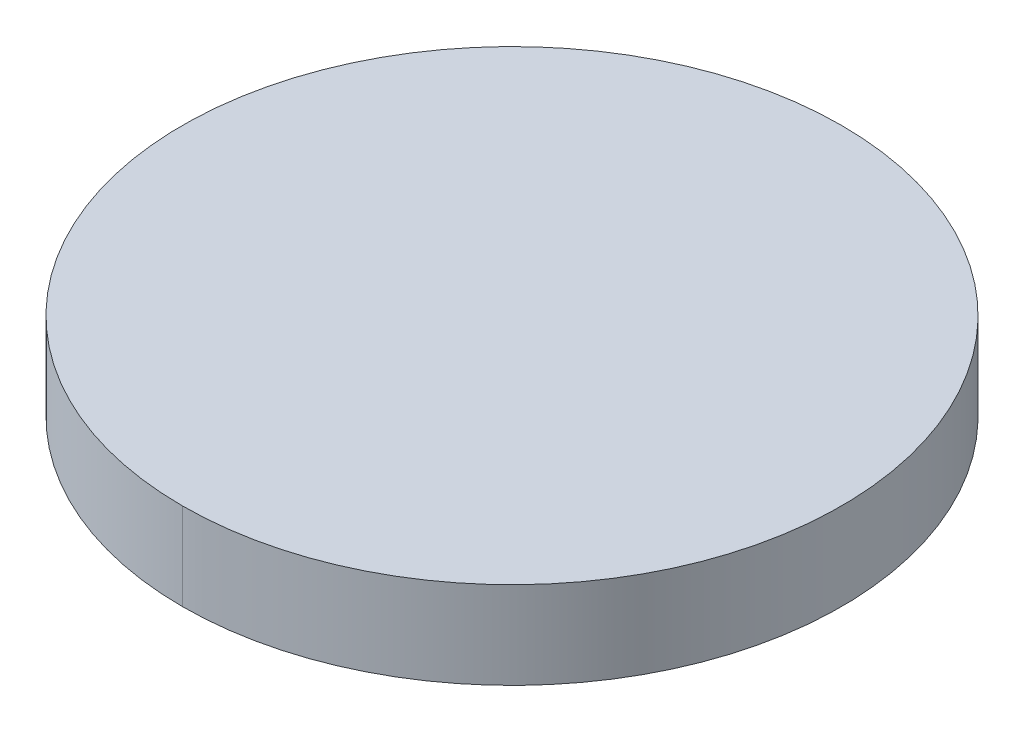
ISO-10303-21;
HEADER;
FILE_DESCRIPTION(('STEP AP214'),'2;1');
FILE_NAME('part.step','',(''),(''),'','','');
FILE_SCHEMA(('AUTOMOTIVE_DESIGN { 1 0 10303 214 1 1 1 1 }'));
ENDSEC;
DATA;
#1=APPLICATION_CONTEXT('core data for automotive mechanical design processes');
#2=APPLICATION_PROTOCOL_DEFINITION('international standard','automotive_design',2000,#1);
#3=PRODUCT_CONTEXT('',#1,'mechanical');
#4=PRODUCT('Part','Part','',(#3));
#5=PRODUCT_RELATED_PRODUCT_CATEGORY('part','',(#4));
#6=PRODUCT_DEFINITION_FORMATION('','',#4);
#7=PRODUCT_DEFINITION_CONTEXT('part definition',#1,'design');
#8=PRODUCT_DEFINITION('design','',#6,#7);
#9=PRODUCT_DEFINITION_SHAPE('','',#8);
#10=(LENGTH_UNIT() NAMED_UNIT(*) SI_UNIT(.MILLI.,.METRE.));
#11=(NAMED_UNIT(*) PLANE_ANGLE_UNIT() SI_UNIT($,.RADIAN.));
#12=(NAMED_UNIT(*) SI_UNIT($,.STERADIAN.) SOLID_ANGLE_UNIT());
#13=UNCERTAINTY_MEASURE_WITH_UNIT(LENGTH_MEASURE(1.E-05),#10,'distance_accuracy_value','');
#14=(GEOMETRIC_REPRESENTATION_CONTEXT(3) GLOBAL_UNCERTAINTY_ASSIGNED_CONTEXT((#13)) GLOBAL_UNIT_ASSIGNED_CONTEXT((#10,
#11,#12)) REPRESENTATION_CONTEXT('',''));
#15=CARTESIAN_POINT('',(0.,0.,0.));
#16=DIRECTION('',(0.,0.,1.));
#17=DIRECTION('',(1.,0.,0.));
#18=AXIS2_PLACEMENT_3D('',#15,#16,#17);
#19=CARTESIAN_POINT('',(0.908753238835547,0.,0.));
#20=DIRECTION('',(0.,1.,0.));
#21=DIRECTION('',(1.,0.,0.));
#22=AXIS2_PLACEMENT_3D('',#19,#20,#21);
#23=PLANE('',#22);
#24=CARTESIAN_POINT('',(0.908753238835547,0.,0.));
#25=DIRECTION('',(0.,1.,0.));
#26=DIRECTION('',(0.,0.,1.));
#27=AXIS2_PLACEMENT_3D('',#24,#25,#26);
#28=CIRCLE('',#27,37.777278100094);
#29=CARTESIAN_POINT('',(0.908753238835547,0.,-37.777278100094));
#30=VERTEX_POINT('',#29);
#31=CARTESIAN_POINT('',(0.908753238835551,0.,37.777278100094));
#32=VERTEX_POINT('',#31);
#33=EDGE_CURVE('E11',#30,#32,#28,.T.);
#34=ORIENTED_EDGE('',*,*,#33,.F.);
#35=CARTESIAN_POINT('',(0.908753238835547,0.,0.));
#36=DIRECTION('',(0.,1.,0.));
#37=DIRECTION('',(0.,0.,1.));
#38=AXIS2_PLACEMENT_3D('',#35,#36,#37);
#39=CIRCLE('',#38,37.777278100094);
#40=EDGE_CURVE('E66',#32,#30,#39,.T.);
#41=ORIENTED_EDGE('',*,*,#40,.F.);
#42=EDGE_LOOP('',(#34,#41));
#43=FACE_BOUND('',#42,.T.);
#44=ADVANCED_FACE('F17',(#43),#23,.F.);
#45=CARTESIAN_POINT('',(0.908753238835547,10.,0.));
#46=DIRECTION('',(0.,1.,0.));
#47=DIRECTION('',(1.,0.,0.));
#48=AXIS2_PLACEMENT_3D('',#45,#46,#47);
#49=PLANE('',#48);
#50=CARTESIAN_POINT('',(0.908753238835547,10.,0.));
#51=DIRECTION('',(0.,1.,0.));
#52=DIRECTION('',(0.,0.,1.));
#53=AXIS2_PLACEMENT_3D('',#50,#51,#52);
#54=CIRCLE('',#53,37.777278100094);
#55=CARTESIAN_POINT('',(0.908753238835547,10.,-37.777278100094));
#56=VERTEX_POINT('',#55);
#57=CARTESIAN_POINT('',(0.908753238835551,10.,37.777278100094));
#58=VERTEX_POINT('',#57);
#59=EDGE_CURVE('E28',#56,#58,#54,.T.);
#60=ORIENTED_EDGE('',*,*,#59,.T.);
#61=CARTESIAN_POINT('',(0.908753238835547,10.,0.));
#62=DIRECTION('',(0.,1.,0.));
#63=DIRECTION('',(0.,0.,1.));
#64=AXIS2_PLACEMENT_3D('',#61,#62,#63);
#65=CIRCLE('',#64,37.777278100094);
#66=EDGE_CURVE('E65',#58,#56,#65,.T.);
#67=ORIENTED_EDGE('',*,*,#66,.T.);
#68=EDGE_LOOP('',(#60,#67));
#69=FACE_BOUND('',#68,.T.);
#70=ADVANCED_FACE('F68',(#69),#49,.T.);
#71=CARTESIAN_POINT('',(0.908753238835547,10.,0.));
#72=DIRECTION('',(0.,-1.,0.));
#73=DIRECTION('',(0.,0.,-1.));
#74=AXIS2_PLACEMENT_3D('',#71,#72,#73);
#75=CYLINDRICAL_SURFACE('',#74,37.777278100094);
#76=DIRECTION('',(0.,-1.,0.));
#77=VECTOR('',#76,1.);
#78=CARTESIAN_POINT('',(0.908753238835551,10.,37.777278100094));
#79=LINE('',#78,#77);
#80=EDGE_CURVE('E59',#58,#32,#79,.T.);
#81=ORIENTED_EDGE('',*,*,#80,.F.);
#82=ORIENTED_EDGE('',*,*,#59,.F.);
#83=DIRECTION('',(0.,-1.,0.));
#84=VECTOR('',#83,1.);
#85=CARTESIAN_POINT('',(0.908753238835547,10.,-37.777278100094));
#86=LINE('',#85,#84);
#87=EDGE_CURVE('E21',#56,#30,#86,.T.);
#88=ORIENTED_EDGE('',*,*,#87,.T.);
#89=ORIENTED_EDGE('',*,*,#33,.T.);
#90=EDGE_LOOP('',(#81,#82,#88,#89));
#91=FACE_BOUND('',#90,.T.);
#92=ADVANCED_FACE('F19',(#91),#75,.T.);
#93=CARTESIAN_POINT('',(0.908753238835547,10.,0.));
#94=DIRECTION('',(0.,-1.,0.));
#95=DIRECTION('',(0.,0.,-1.));
#96=AXIS2_PLACEMENT_3D('',#93,#94,#95);
#97=CYLINDRICAL_SURFACE('',#96,37.777278100094);
#98=ORIENTED_EDGE('',*,*,#66,.F.);
#99=ORIENTED_EDGE('',*,*,#80,.T.);
#100=ORIENTED_EDGE('',*,*,#40,.T.);
#101=ORIENTED_EDGE('',*,*,#87,.F.);
#102=EDGE_LOOP('',(#98,#99,#100,#101));
#103=FACE_BOUND('',#102,.T.);
#104=ADVANCED_FACE('F64',(#103),#97,.T.);
#105=CLOSED_SHELL('',(#44,#70,#92,#104));
#106=MANIFOLD_SOLID_BREP('B1',#105);
#107=ADVANCED_BREP_SHAPE_REPRESENTATION('',(#18,#106),#14);
#108=SHAPE_DEFINITION_REPRESENTATION(#9,#107);
ENDSEC;
END-ISO-10303-21;
